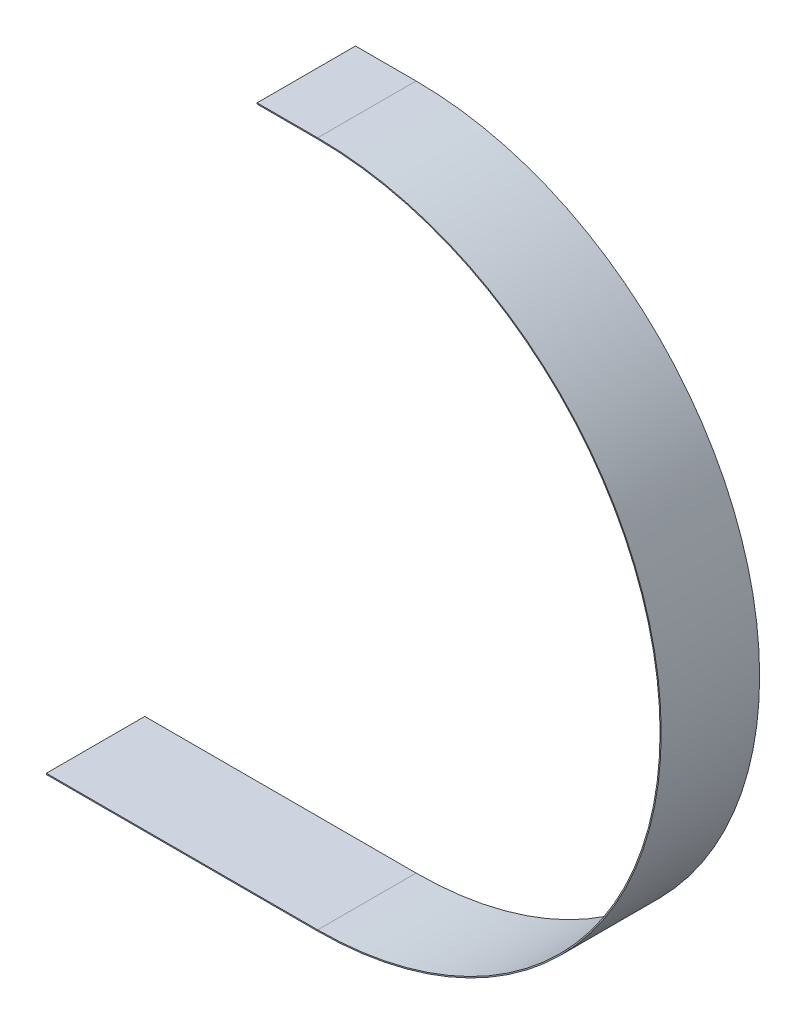
ISO-10303-21;
HEADER;
FILE_DESCRIPTION(('STEP AP214'),'2;1');
FILE_NAME('part.step','',(''),(''),'','','');
FILE_SCHEMA(('AUTOMOTIVE_DESIGN { 1 0 10303 214 1 1 1 1 }'));
ENDSEC;
DATA;
#1=APPLICATION_CONTEXT('core data for automotive mechanical design processes');
#2=APPLICATION_PROTOCOL_DEFINITION('international standard','automotive_design',2000,#1);
#3=PRODUCT_CONTEXT('',#1,'mechanical');
#4=PRODUCT('Part','Part','',(#3));
#5=PRODUCT_RELATED_PRODUCT_CATEGORY('part','',(#4));
#6=PRODUCT_DEFINITION_FORMATION('','',#4);
#7=PRODUCT_DEFINITION_CONTEXT('part definition',#1,'design');
#8=PRODUCT_DEFINITION('design','',#6,#7);
#9=PRODUCT_DEFINITION_SHAPE('','',#8);
#10=(LENGTH_UNIT() NAMED_UNIT(*) SI_UNIT(.MILLI.,.METRE.));
#11=(NAMED_UNIT(*) PLANE_ANGLE_UNIT() SI_UNIT($,.RADIAN.));
#12=(NAMED_UNIT(*) SI_UNIT($,.STERADIAN.) SOLID_ANGLE_UNIT());
#13=UNCERTAINTY_MEASURE_WITH_UNIT(LENGTH_MEASURE(1.E-05),#10,'distance_accuracy_value','');
#14=(GEOMETRIC_REPRESENTATION_CONTEXT(3) GLOBAL_UNCERTAINTY_ASSIGNED_CONTEXT((#13)) GLOBAL_UNIT_ASSIGNED_CONTEXT((#10,
#11,#12)) REPRESENTATION_CONTEXT('',''));
#15=CARTESIAN_POINT('',(0.,0.,0.));
#16=DIRECTION('',(0.,0.,1.));
#17=DIRECTION('',(1.,0.,0.));
#18=AXIS2_PLACEMENT_3D('',#15,#16,#17);
#19=CARTESIAN_POINT('',(0.,0.121,5.25));
#20=DIRECTION('',(1.,0.,0.));
#21=DIRECTION('',(0.,0.,-1.));
#22=AXIS2_PLACEMENT_3D('',#19,#20,#21);
#23=PLANE('',#22);
#24=DIRECTION('',(0.,-1.,0.));
#25=VECTOR('',#24,1.);
#26=CARTESIAN_POINT('',(0.,0.121,-5.25));
#27=LINE('',#26,#25);
#28=CARTESIAN_POINT('',(0.,0.121,-5.25));
#29=VERTEX_POINT('',#28);
#30=CARTESIAN_POINT('',(0.,0.,-5.25));
#31=VERTEX_POINT('',#30);
#32=EDGE_CURVE('E135',#29,#31,#27,.T.);
#33=ORIENTED_EDGE('',*,*,#32,.T.);
#34=DIRECTION('',(0.,0.,-1.));
#35=VECTOR('',#34,1.);
#36=CARTESIAN_POINT('',(0.,0.,5.25));
#37=LINE('',#36,#35);
#38=CARTESIAN_POINT('',(0.,0.,5.25));
#39=VERTEX_POINT('',#38);
#40=EDGE_CURVE('E11',#39,#31,#37,.T.);
#41=ORIENTED_EDGE('',*,*,#40,.F.);
#42=DIRECTION('',(0.,-1.,0.));
#43=VECTOR('',#42,1.);
#44=CARTESIAN_POINT('',(0.,0.121,5.25));
#45=LINE('',#44,#43);
#46=CARTESIAN_POINT('',(0.,0.121,5.25));
#47=VERTEX_POINT('',#46);
#48=EDGE_CURVE('E149',#47,#39,#45,.T.);
#49=ORIENTED_EDGE('',*,*,#48,.F.);
#50=DIRECTION('',(0.,0.,-1.));
#51=VECTOR('',#50,1.);
#52=CARTESIAN_POINT('',(0.,0.121,5.25));
#53=LINE('',#52,#51);
#54=EDGE_CURVE('E131',#47,#29,#53,.T.);
#55=ORIENTED_EDGE('',*,*,#54,.T.);
#56=EDGE_LOOP('',(#33,#41,#49,#55));
#57=FACE_BOUND('',#56,.T.);
#58=ADVANCED_FACE('F39',(#57),#23,.F.);
#59=CARTESIAN_POINT('',(0.,0.,5.25));
#60=DIRECTION('',(0.,1.,0.));
#61=DIRECTION('',(0.,0.,1.));
#62=AXIS2_PLACEMENT_3D('',#59,#60,#61);
#63=PLANE('',#62);
#64=DIRECTION('',(1.,0.,0.));
#65=VECTOR('',#64,1.);
#66=CARTESIAN_POINT('',(0.,0.,-5.25));
#67=LINE('',#66,#65);
#68=CARTESIAN_POINT('',(28.941750092,0.,-5.25));
#69=VERTEX_POINT('',#68);
#70=EDGE_CURVE('E138',#31,#69,#67,.T.);
#71=ORIENTED_EDGE('',*,*,#70,.T.);
#72=DIRECTION('',(0.,0.,-1.));
#73=VECTOR('',#72,1.);
#74=CARTESIAN_POINT('',(28.941750092,0.,5.25));
#75=LINE('',#74,#73);
#76=CARTESIAN_POINT('',(28.941750092,0.,5.25));
#77=VERTEX_POINT('',#76);
#78=EDGE_CURVE('E47',#77,#69,#75,.T.);
#79=ORIENTED_EDGE('',*,*,#78,.F.);
#80=DIRECTION('',(1.,0.,0.));
#81=VECTOR('',#80,1.);
#82=CARTESIAN_POINT('',(0.,0.,5.25));
#83=LINE('',#82,#81);
#84=EDGE_CURVE('E98',#39,#77,#83,.T.);
#85=ORIENTED_EDGE('',*,*,#84,.F.);
#86=ORIENTED_EDGE('',*,*,#40,.T.);
#87=EDGE_LOOP('',(#71,#79,#85,#86));
#88=FACE_BOUND('',#87,.T.);
#89=ADVANCED_FACE('F184',(#88),#63,.F.);
#90=CARTESIAN_POINT('',(28.941750092,36.648375008,5.25));
#91=DIRECTION('',(0.,0.,-1.));
#92=DIRECTION('',(-1.,0.,0.));
#93=AXIS2_PLACEMENT_3D('',#90,#91,#92);
#94=CYLINDRICAL_SURFACE('',#93,36.648375008);
#95=CARTESIAN_POINT('',(28.941750092,36.648375008,-5.25));
#96=DIRECTION('',(0.,0.,1.));
#97=DIRECTION('',(1.,0.,0.));
#98=AXIS2_PLACEMENT_3D('',#95,#96,#97);
#99=CIRCLE('',#98,36.648375008);
#100=CARTESIAN_POINT('',(28.941750092,73.296750016,-5.25));
#101=VERTEX_POINT('',#100);
#102=EDGE_CURVE('E140',#69,#101,#99,.T.);
#103=ORIENTED_EDGE('',*,*,#102,.T.);
#104=DIRECTION('',(0.,0.,-1.));
#105=VECTOR('',#104,1.);
#106=CARTESIAN_POINT('',(28.941750092,73.296750016,5.25));
#107=LINE('',#106,#105);
#108=CARTESIAN_POINT('',(28.941750092,73.296750016,5.25));
#109=VERTEX_POINT('',#108);
#110=EDGE_CURVE('E156',#109,#101,#107,.T.);
#111=ORIENTED_EDGE('',*,*,#110,.F.);
#112=CARTESIAN_POINT('',(28.941750092,36.648375008,5.25));
#113=DIRECTION('',(0.,0.,1.));
#114=DIRECTION('',(1.,0.,0.));
#115=AXIS2_PLACEMENT_3D('',#112,#113,#114);
#116=CIRCLE('',#115,36.648375008);
#117=EDGE_CURVE('E164',#77,#109,#116,.T.);
#118=ORIENTED_EDGE('',*,*,#117,.F.);
#119=ORIENTED_EDGE('',*,*,#78,.T.);
#120=EDGE_LOOP('',(#103,#111,#118,#119));
#121=FACE_BOUND('',#120,.T.);
#122=ADVANCED_FACE('F162',(#121),#94,.T.);
#123=CARTESIAN_POINT('',(28.941750092,73.296750016,5.25));
#124=DIRECTION('',(0.,-1.,0.));
#125=DIRECTION('',(0.,0.,-1.));
#126=AXIS2_PLACEMENT_3D('',#123,#124,#125);
#127=PLANE('',#126);
#128=DIRECTION('',(-1.,0.,0.));
#129=VECTOR('',#128,1.);
#130=CARTESIAN_POINT('',(28.941750092,73.296750016,-5.25));
#131=LINE('',#130,#129);
#132=CARTESIAN_POINT('',(22.479000127,73.296750016,-5.25));
#133=VERTEX_POINT('',#132);
#134=EDGE_CURVE('E142',#101,#133,#131,.T.);
#135=ORIENTED_EDGE('',*,*,#134,.T.);
#136=DIRECTION('',(0.,0.,-1.));
#137=VECTOR('',#136,1.);
#138=CARTESIAN_POINT('',(22.479000127,73.296750016,5.25));
#139=LINE('',#138,#137);
#140=CARTESIAN_POINT('',(22.479000127,73.296750016,5.25));
#141=VERTEX_POINT('',#140);
#142=EDGE_CURVE('E153',#141,#133,#139,.T.);
#143=ORIENTED_EDGE('',*,*,#142,.F.);
#144=DIRECTION('',(-1.,0.,0.));
#145=VECTOR('',#144,1.);
#146=CARTESIAN_POINT('',(28.941750092,73.296750016,5.25));
#147=LINE('',#146,#145);
#148=EDGE_CURVE('E176',#109,#141,#147,.T.);
#149=ORIENTED_EDGE('',*,*,#148,.F.);
#150=ORIENTED_EDGE('',*,*,#110,.T.);
#151=EDGE_LOOP('',(#135,#143,#149,#150));
#152=FACE_BOUND('',#151,.T.);
#153=ADVANCED_FACE('F172',(#152),#127,.F.);
#154=CARTESIAN_POINT('',(22.479000127,73.296750016,5.25));
#155=DIRECTION('',(1.,0.,0.));
#156=DIRECTION('',(0.,0.,-1.));
#157=AXIS2_PLACEMENT_3D('',#154,#155,#156);
#158=PLANE('',#157);
#159=DIRECTION('',(0.,-1.,0.));
#160=VECTOR('',#159,1.);
#161=CARTESIAN_POINT('',(22.479000127,73.296750016,-5.25));
#162=LINE('',#161,#160);
#163=CARTESIAN_POINT('',(22.479000127,73.175750016,-5.25));
#164=VERTEX_POINT('',#163);
#165=EDGE_CURVE('E144',#133,#164,#162,.T.);
#166=ORIENTED_EDGE('',*,*,#165,.T.);
#167=DIRECTION('',(0.,0.,-1.));
#168=VECTOR('',#167,1.);
#169=CARTESIAN_POINT('',(22.479000127,73.175750016,5.25));
#170=LINE('',#169,#168);
#171=CARTESIAN_POINT('',(22.479000127,73.175750016,5.25));
#172=VERTEX_POINT('',#171);
#173=EDGE_CURVE('E126',#172,#164,#170,.T.);
#174=ORIENTED_EDGE('',*,*,#173,.F.);
#175=DIRECTION('',(0.,-1.,0.));
#176=VECTOR('',#175,1.);
#177=CARTESIAN_POINT('',(22.479000127,73.296750016,5.25));
#178=LINE('',#177,#176);
#179=EDGE_CURVE('E117',#141,#172,#178,.T.);
#180=ORIENTED_EDGE('',*,*,#179,.F.);
#181=ORIENTED_EDGE('',*,*,#142,.T.);
#182=EDGE_LOOP('',(#166,#174,#180,#181));
#183=FACE_BOUND('',#182,.T.);
#184=ADVANCED_FACE('F175',(#183),#158,.F.);
#185=CARTESIAN_POINT('',(28.941750092,73.175750016,5.25));
#186=DIRECTION('',(0.,1.,0.));
#187=DIRECTION('',(0.,0.,1.));
#188=AXIS2_PLACEMENT_3D('',#185,#186,#187);
#189=PLANE('',#188);
#190=DIRECTION('',(1.,0.,0.));
#191=VECTOR('',#190,1.);
#192=CARTESIAN_POINT('',(28.941750092,73.175750016,-5.25));
#193=LINE('',#192,#191);
#194=CARTESIAN_POINT('',(28.941750092,73.175750016,-5.25));
#195=VERTEX_POINT('',#194);
#196=EDGE_CURVE('E125',#164,#195,#193,.T.);
#197=ORIENTED_EDGE('',*,*,#196,.T.);
#198=DIRECTION('',(0.,0.,-1.));
#199=VECTOR('',#198,1.);
#200=CARTESIAN_POINT('',(28.941750092,73.175750016,5.25));
#201=LINE('',#200,#199);
#202=CARTESIAN_POINT('',(28.941750092,73.175750016,5.25));
#203=VERTEX_POINT('',#202);
#204=EDGE_CURVE('E122',#203,#195,#201,.T.);
#205=ORIENTED_EDGE('',*,*,#204,.F.);
#206=DIRECTION('',(1.,0.,0.));
#207=VECTOR('',#206,1.);
#208=CARTESIAN_POINT('',(28.941750092,73.175750016,5.25));
#209=LINE('',#208,#207);
#210=EDGE_CURVE('E111',#172,#203,#209,.T.);
#211=ORIENTED_EDGE('',*,*,#210,.F.);
#212=ORIENTED_EDGE('',*,*,#173,.T.);
#213=EDGE_LOOP('',(#197,#205,#211,#212));
#214=FACE_BOUND('',#213,.T.);
#215=ADVANCED_FACE('F123',(#214),#189,.F.);
#216=CARTESIAN_POINT('',(28.941750092,36.648375008,5.25));
#217=DIRECTION('',(0.,0.,-1.));
#218=DIRECTION('',(-1.,0.,0.));
#219=AXIS2_PLACEMENT_3D('',#216,#217,#218);
#220=CYLINDRICAL_SURFACE('',#219,36.527375008);
#221=CARTESIAN_POINT('',(28.941750092,36.648375008,-5.25));
#222=DIRECTION('',(0.,0.,-1.));
#223=DIRECTION('',(1.,0.,0.));
#224=AXIS2_PLACEMENT_3D('',#221,#222,#223);
#225=CIRCLE('',#224,36.527375008);
#226=CARTESIAN_POINT('',(28.941750092,0.12100000000001,-5.25));
#227=VERTEX_POINT('',#226);
#228=EDGE_CURVE('E84',#195,#227,#225,.T.);
#229=ORIENTED_EDGE('',*,*,#228,.T.);
#230=DIRECTION('',(0.,0.,-1.));
#231=VECTOR('',#230,1.);
#232=CARTESIAN_POINT('',(28.941750092,0.12100000000001,5.25));
#233=LINE('',#232,#231);
#234=CARTESIAN_POINT('',(28.941750092,0.12100000000001,5.25));
#235=VERTEX_POINT('',#234);
#236=EDGE_CURVE('E127',#235,#227,#233,.T.);
#237=ORIENTED_EDGE('',*,*,#236,.F.);
#238=CARTESIAN_POINT('',(28.941750092,36.648375008,5.25));
#239=DIRECTION('',(0.,0.,-1.));
#240=DIRECTION('',(1.,0.,0.));
#241=AXIS2_PLACEMENT_3D('',#238,#239,#240);
#242=CIRCLE('',#241,36.527375008);
#243=EDGE_CURVE('E115',#203,#235,#242,.T.);
#244=ORIENTED_EDGE('',*,*,#243,.F.);
#245=ORIENTED_EDGE('',*,*,#204,.T.);
#246=EDGE_LOOP('',(#229,#237,#244,#245));
#247=FACE_BOUND('',#246,.T.);
#248=ADVANCED_FACE('F129',(#247),#220,.F.);
#249=CARTESIAN_POINT('',(0.,0.121,5.25));
#250=DIRECTION('',(0.,-1.,0.));
#251=DIRECTION('',(0.,0.,-1.));
#252=AXIS2_PLACEMENT_3D('',#249,#250,#251);
#253=PLANE('',#252);
#254=DIRECTION('',(-1.,0.,0.));
#255=VECTOR('',#254,1.);
#256=CARTESIAN_POINT('',(0.,0.121,-5.25));
#257=LINE('',#256,#255);
#258=EDGE_CURVE('E90',#227,#29,#257,.T.);
#259=ORIENTED_EDGE('',*,*,#258,.T.);
#260=ORIENTED_EDGE('',*,*,#54,.F.);
#261=DIRECTION('',(-1.,0.,0.));
#262=VECTOR('',#261,1.);
#263=CARTESIAN_POINT('',(0.,0.121,5.25));
#264=LINE('',#263,#262);
#265=EDGE_CURVE('E55',#235,#47,#264,.T.);
#266=ORIENTED_EDGE('',*,*,#265,.F.);
#267=ORIENTED_EDGE('',*,*,#236,.T.);
#268=EDGE_LOOP('',(#259,#260,#266,#267));
#269=FACE_BOUND('',#268,.T.);
#270=ADVANCED_FACE('F200',(#269),#253,.F.);
#271=CARTESIAN_POINT('',(28.941750092,36.648375008,5.25));
#272=DIRECTION('',(0.,0.,1.));
#273=DIRECTION('',(1.,0.,0.));
#274=AXIS2_PLACEMENT_3D('',#271,#272,#273);
#275=PLANE('',#274);
#276=ORIENTED_EDGE('',*,*,#48,.T.);
#277=ORIENTED_EDGE('',*,*,#84,.T.);
#278=ORIENTED_EDGE('',*,*,#117,.T.);
#279=ORIENTED_EDGE('',*,*,#148,.T.);
#280=ORIENTED_EDGE('',*,*,#179,.T.);
#281=ORIENTED_EDGE('',*,*,#210,.T.);
#282=ORIENTED_EDGE('',*,*,#243,.T.);
#283=ORIENTED_EDGE('',*,*,#265,.T.);
#284=EDGE_LOOP('',(#276,#277,#278,#279,#280,#281,#282,#283));
#285=FACE_BOUND('',#284,.T.);
#286=ADVANCED_FACE('F113',(#285),#275,.T.);
#287=CARTESIAN_POINT('',(28.941750092,36.648375008,-5.25));
#288=DIRECTION('',(0.,0.,1.));
#289=DIRECTION('',(1.,0.,0.));
#290=AXIS2_PLACEMENT_3D('',#287,#288,#289);
#291=PLANE('',#290);
#292=ORIENTED_EDGE('',*,*,#32,.F.);
#293=ORIENTED_EDGE('',*,*,#258,.F.);
#294=ORIENTED_EDGE('',*,*,#228,.F.);
#295=ORIENTED_EDGE('',*,*,#196,.F.);
#296=ORIENTED_EDGE('',*,*,#165,.F.);
#297=ORIENTED_EDGE('',*,*,#134,.F.);
#298=ORIENTED_EDGE('',*,*,#102,.F.);
#299=ORIENTED_EDGE('',*,*,#70,.F.);
#300=EDGE_LOOP('',(#292,#293,#294,#295,#296,#297,#298,#299));
#301=FACE_BOUND('',#300,.T.);
#302=ADVANCED_FACE('F168',(#301),#291,.F.);
#303=CLOSED_SHELL('',(#58,#89,#122,#153,#184,#215,#248,#270,#286,#302));
#304=MANIFOLD_SOLID_BREP('B2',#303);
#305=ADVANCED_BREP_SHAPE_REPRESENTATION('',(#18,#304),#14);
#306=SHAPE_DEFINITION_REPRESENTATION(#9,#305);
ENDSEC;
END-ISO-10303-21;
